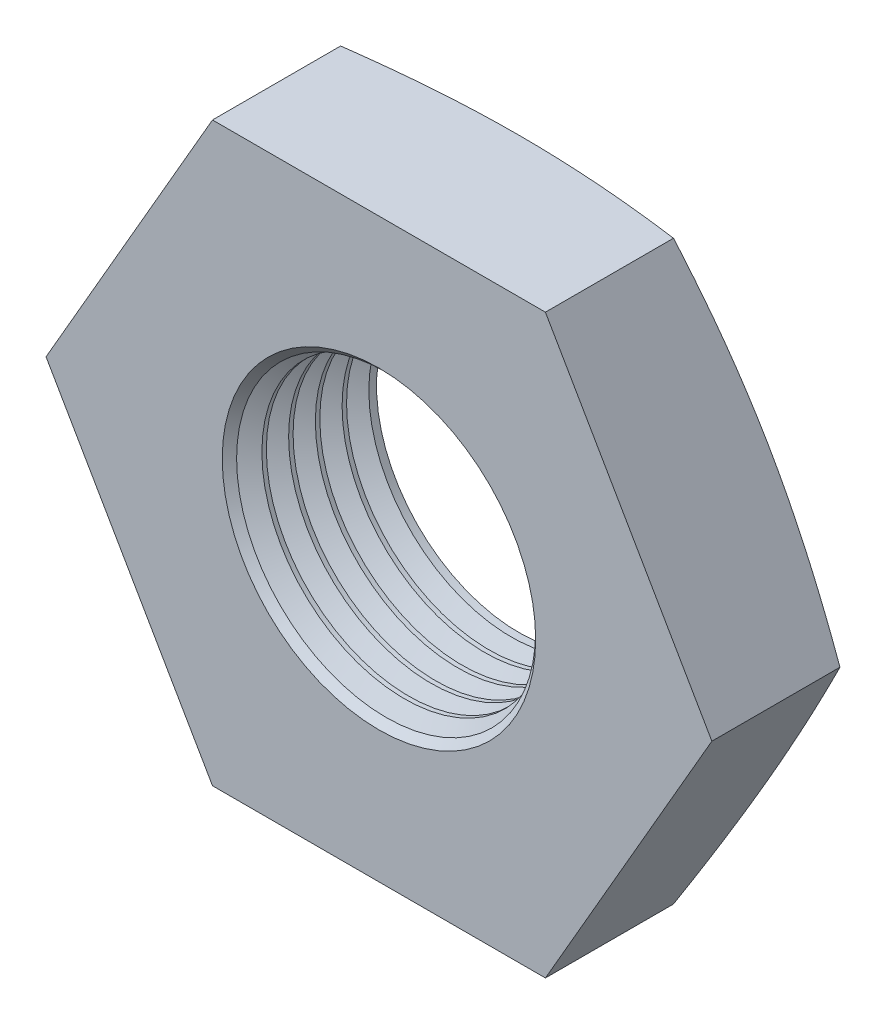
ISO-10303-21;
HEADER;
FILE_DESCRIPTION(('STEP AP214'),'2;1');
FILE_NAME('part.step','',(''),(''),'','','');
FILE_SCHEMA(('AUTOMOTIVE_DESIGN { 1 0 10303 214 1 1 1 1 }'));
ENDSEC;
DATA;
#1=APPLICATION_CONTEXT('core data for automotive mechanical design processes');
#2=APPLICATION_PROTOCOL_DEFINITION('international standard','automotive_design',2000,#1);
#3=PRODUCT_CONTEXT('',#1,'mechanical');
#4=PRODUCT('Part','Part','',(#3));
#5=PRODUCT_RELATED_PRODUCT_CATEGORY('part','',(#4));
#6=PRODUCT_DEFINITION_FORMATION('','',#4);
#7=PRODUCT_DEFINITION_CONTEXT('part definition',#1,'design');
#8=PRODUCT_DEFINITION('design','',#6,#7);
#9=PRODUCT_DEFINITION_SHAPE('','',#8);
#10=(LENGTH_UNIT() NAMED_UNIT(*) SI_UNIT(.MILLI.,.METRE.));
#11=(NAMED_UNIT(*) PLANE_ANGLE_UNIT() SI_UNIT($,.RADIAN.));
#12=(NAMED_UNIT(*) SI_UNIT($,.STERADIAN.) SOLID_ANGLE_UNIT());
#13=UNCERTAINTY_MEASURE_WITH_UNIT(LENGTH_MEASURE(1.E-05),#10,'distance_accuracy_value','');
#14=(GEOMETRIC_REPRESENTATION_CONTEXT(3) GLOBAL_UNCERTAINTY_ASSIGNED_CONTEXT((#13)) GLOBAL_UNIT_ASSIGNED_CONTEXT((#10,
#11,#12)) REPRESENTATION_CONTEXT('',''));
#15=CARTESIAN_POINT('',(0.,0.,0.));
#16=DIRECTION('',(0.,0.,1.));
#17=DIRECTION('',(1.,0.,0.));
#18=AXIS2_PLACEMENT_3D('',#15,#16,#17);
#19=CARTESIAN_POINT('',(0.,0.,-1.7));
#20=DIRECTION('',(0.,0.,1.));
#21=DIRECTION('',(1.,0.,0.));
#22=AXIS2_PLACEMENT_3D('',#19,#20,#21);
#23=CYLINDRICAL_SURFACE('',#22,1.7295);
#24=CARTESIAN_POINT('',(0.,0.,-1.7));
#25=DIRECTION('',(0.,0.,1.));
#26=DIRECTION('',(1.,0.,0.));
#27=AXIS2_PLACEMENT_3D('',#24,#25,#26);
#28=CIRCLE('',#27,1.7295);
#29=CARTESIAN_POINT('',(1.7295,0.,-1.7));
#30=VERTEX_POINT('',#29);
#31=EDGE_CURVE('E220',#30,#30,#28,.T.);
#32=ORIENTED_EDGE('',*,*,#31,.F.);
#33=EDGE_LOOP('',(#32));
#34=FACE_BOUND('',#33,.T.);
#35=CARTESIAN_POINT('',(0.,0.,-1.6066));
#36=DIRECTION('',(0.,0.,-1.));
#37=DIRECTION('',(-1.,0.,0.));
#38=AXIS2_PLACEMENT_3D('',#35,#36,#37);
#39=CIRCLE('',#38,1.7295);
#40=CARTESIAN_POINT('',(-1.7295,0.,-1.6066));
#41=VERTEX_POINT('',#40);
#42=EDGE_CURVE('E373',#41,#41,#39,.T.);
#43=ORIENTED_EDGE('',*,*,#42,.F.);
#44=EDGE_LOOP('',(#43));
#45=FACE_BOUND('',#44,.T.);
#46=ADVANCED_FACE('F36',(#34,#45),#23,.F.);
#47=CARTESIAN_POINT('',(0.,0.,-1.282));
#48=DIRECTION('',(0.,0.,-1.));
#49=DIRECTION('',(-1.,0.,0.));
#50=AXIS2_PLACEMENT_3D('',#47,#48,#49);
#51=CIRCLE('',#50,1.7295);
#52=CARTESIAN_POINT('',(-1.7295,0.,-1.282));
#53=VERTEX_POINT('',#52);
#54=EDGE_CURVE('E384',#53,#53,#51,.T.);
#55=ORIENTED_EDGE('',*,*,#54,.F.);
#56=EDGE_LOOP('',(#55));
#57=FACE_BOUND('',#56,.T.);
#58=CARTESIAN_POINT('',(0.,0.,-1.3361));
#59=DIRECTION('',(0.,0.,-1.));
#60=DIRECTION('',(-1.,0.,0.));
#61=AXIS2_PLACEMENT_3D('',#58,#59,#60);
#62=CIRCLE('',#61,1.7295);
#63=CARTESIAN_POINT('',(-1.7295,0.,-1.3361));
#64=VERTEX_POINT('',#63);
#65=EDGE_CURVE('E370',#64,#64,#62,.T.);
#66=ORIENTED_EDGE('',*,*,#65,.T.);
#67=EDGE_LOOP('',(#66));
#68=FACE_BOUND('',#67,.T.);
#69=ADVANCED_FACE('F277',(#57,#68),#23,.F.);
#70=CARTESIAN_POINT('',(0.,0.,-0.957399999999998));
#71=DIRECTION('',(0.,0.,-1.));
#72=DIRECTION('',(-1.,0.,0.));
#73=AXIS2_PLACEMENT_3D('',#70,#71,#72);
#74=CIRCLE('',#73,1.7295);
#75=CARTESIAN_POINT('',(-1.7295,0.,-0.957399999999998));
#76=VERTEX_POINT('',#75);
#77=EDGE_CURVE('E305',#76,#76,#74,.T.);
#78=ORIENTED_EDGE('',*,*,#77,.F.);
#79=EDGE_LOOP('',(#78));
#80=FACE_BOUND('',#79,.T.);
#81=CARTESIAN_POINT('',(0.,0.,-1.0115));
#82=DIRECTION('',(0.,0.,-1.));
#83=DIRECTION('',(-1.,0.,0.));
#84=AXIS2_PLACEMENT_3D('',#81,#82,#83);
#85=CIRCLE('',#84,1.7295);
#86=CARTESIAN_POINT('',(-1.7295,0.,-1.0115));
#87=VERTEX_POINT('',#86);
#88=EDGE_CURVE('E378',#87,#87,#85,.T.);
#89=ORIENTED_EDGE('',*,*,#88,.T.);
#90=EDGE_LOOP('',(#89));
#91=FACE_BOUND('',#90,.T.);
#92=ADVANCED_FACE('F283',(#80,#91),#23,.F.);
#93=CARTESIAN_POINT('',(0.,0.,-0.632799999999998));
#94=DIRECTION('',(0.,0.,-1.));
#95=DIRECTION('',(-1.,0.,0.));
#96=AXIS2_PLACEMENT_3D('',#93,#94,#95);
#97=CIRCLE('',#96,1.7295);
#98=CARTESIAN_POINT('',(-1.7295,0.,-0.632799999999998));
#99=VERTEX_POINT('',#98);
#100=EDGE_CURVE('E308',#99,#99,#97,.T.);
#101=ORIENTED_EDGE('',*,*,#100,.F.);
#102=EDGE_LOOP('',(#101));
#103=FACE_BOUND('',#102,.T.);
#104=CARTESIAN_POINT('',(0.,0.,-0.686899999999998));
#105=DIRECTION('',(0.,0.,-1.));
#106=DIRECTION('',(-1.,0.,0.));
#107=AXIS2_PLACEMENT_3D('',#104,#105,#106);
#108=CIRCLE('',#107,1.7295);
#109=CARTESIAN_POINT('',(-1.7295,0.,-0.686899999999998));
#110=VERTEX_POINT('',#109);
#111=EDGE_CURVE('E387',#110,#110,#108,.T.);
#112=ORIENTED_EDGE('',*,*,#111,.T.);
#113=EDGE_LOOP('',(#112));
#114=FACE_BOUND('',#113,.T.);
#115=ADVANCED_FACE('F288',(#103,#114),#23,.F.);
#116=CARTESIAN_POINT('',(0.,0.,-0.308199999999998));
#117=DIRECTION('',(0.,0.,-1.));
#118=DIRECTION('',(-1.,0.,0.));
#119=AXIS2_PLACEMENT_3D('',#116,#117,#118);
#120=CIRCLE('',#119,1.7295);
#121=CARTESIAN_POINT('',(-1.7295,0.,-0.308199999999998));
#122=VERTEX_POINT('',#121);
#123=EDGE_CURVE('E299',#122,#122,#120,.T.);
#124=ORIENTED_EDGE('',*,*,#123,.F.);
#125=EDGE_LOOP('',(#124));
#126=FACE_BOUND('',#125,.T.);
#127=CARTESIAN_POINT('',(0.,0.,-0.362299999999998));
#128=DIRECTION('',(0.,0.,-1.));
#129=DIRECTION('',(-1.,0.,0.));
#130=AXIS2_PLACEMENT_3D('',#127,#128,#129);
#131=CIRCLE('',#130,1.7295);
#132=CARTESIAN_POINT('',(-1.7295,0.,-0.362299999999998));
#133=VERTEX_POINT('',#132);
#134=EDGE_CURVE('E302',#133,#133,#131,.T.);
#135=ORIENTED_EDGE('',*,*,#134,.T.);
#136=EDGE_LOOP('',(#135));
#137=FACE_BOUND('',#136,.T.);
#138=ADVANCED_FACE('F279',(#126,#137),#23,.F.);
#139=CARTESIAN_POINT('',(0.,0.,-0.172949999999998));
#140=DIRECTION('',(0.,0.,1.));
#141=DIRECTION('',(1.,0.,0.));
#142=AXIS2_PLACEMENT_3D('',#139,#140,#141);
#143=CONICAL_SURFACE('',#142,1.7295,0.785398163397451);
#144=CARTESIAN_POINT('',(0.,0.,0.));
#145=DIRECTION('',(0.,0.,1.));
#146=DIRECTION('',(1.,0.,0.));
#147=AXIS2_PLACEMENT_3D('',#144,#145,#146);
#148=CIRCLE('',#147,1.90245);
#149=CARTESIAN_POINT('',(1.90245,0.,0.));
#150=VERTEX_POINT('',#149);
#151=EDGE_CURVE('E11',#150,#150,#148,.F.);
#152=ORIENTED_EDGE('',*,*,#151,.F.);
#153=EDGE_LOOP('',(#152));
#154=FACE_BOUND('',#153,.T.);
#155=CARTESIAN_POINT('',(0.,0.,-0.0872049358618433));
#156=DIRECTION('',(0.,0.,-1.));
#157=DIRECTION('',(-1.,0.,0.));
#158=AXIS2_PLACEMENT_3D('',#155,#156,#157);
#159=CIRCLE('',#158,1.81524506413816);
#160=CARTESIAN_POINT('',(-1.81524506413816,0.,-0.0872049358618433));
#161=VERTEX_POINT('',#160);
#162=EDGE_CURVE('E40',#161,#161,#159,.T.);
#163=ORIENTED_EDGE('',*,*,#162,.T.);
#164=EDGE_LOOP('',(#163));
#165=FACE_BOUND('',#164,.T.);
#166=ADVANCED_FACE('F38',(#154,#165),#143,.F.);
#167=CARTESIAN_POINT('',(-2.02072594216369,-3.5,-1.7));
#168=DIRECTION('',(0.,-1.,0.));
#169=DIRECTION('',(0.,0.,-1.));
#170=AXIS2_PLACEMENT_3D('',#167,#168,#169);
#171=PLANE('',#170);
#172=CARTESIAN_POINT('',(-5.34250540243529,-3.5,-0.926460153703001));
#173=CARTESIAN_POINT('',(-5.18375511671644,-3.5,-0.962032372708151));
#174=CARTESIAN_POINT('',(-5.02490552043847,-3.5,-0.997168370742541));
#175=CARTESIAN_POINT('',(-4.70695877225528,-3.5,-1.06633415335759));
#176=CARTESIAN_POINT('',(-4.5478616099486,-3.5,-1.10036389006764));
#177=CARTESIAN_POINT('',(-4.22922785596206,-3.5,-1.16711307984257));
#178=CARTESIAN_POINT('',(-4.06969098596063,-3.5,-1.1998312109674));
#179=CARTESIAN_POINT('',(-3.75028550399467,-3.5,-1.26359691073799));
#180=CARTESIAN_POINT('',(-3.59041689484826,-3.5,-1.29464449351522));
#181=CARTESIAN_POINT('',(-3.11278775858948,-3.5,-1.38424317610052));
#182=CARTESIAN_POINT('',(-2.7944536274191,-3.5,-1.4397960921004));
#183=CARTESIAN_POINT('',(-2.15584280750445,-3.5,-1.53857753520242));
#184=CARTESIAN_POINT('',(-1.83556646684102,-3.5,-1.58180820769069));
#185=CARTESIAN_POINT('',(-1.35186201394615,-3.5,-1.63326780806071));
#186=CARTESIAN_POINT('',(-1.18915391181551,-3.5,-1.64823562569859));
#187=CARTESIAN_POINT('',(-0.863327752554062,-3.5,-1.67279914319906));
#188=CARTESIAN_POINT('',(-0.700209704910771,-3.5,-1.6823949662583));
#189=CARTESIAN_POINT('',(-0.373802177523218,-3.5,-1.69565632714604));
#190=CARTESIAN_POINT('',(-0.21051280887918,-3.5,-1.69932454883453));
#191=CARTESIAN_POINT('',(0.116088611208562,-3.5,-1.70050481492705));
#192=CARTESIAN_POINT('',(0.27940066263463,-3.5,-1.69801686409105));
#193=CARTESIAN_POINT('',(0.60640968441319,-3.5,-1.68702500364934));
#194=CARTESIAN_POINT('',(0.77010590916335,-3.5,-1.67849935713373));
#195=CARTESIAN_POINT('',(1.09711815279145,-3.5,-1.65591780097622));
#196=CARTESIAN_POINT('',(1.26043415057105,-3.5,-1.64186159147595));
#197=CARTESIAN_POINT('',(1.58667719858699,-3.5,-1.60892981836055));
#198=CARTESIAN_POINT('',(1.74960393516029,-3.5,-1.59005119345729));
#199=CARTESIAN_POINT('',(2.07493184102748,-3.5,-1.54825406645032));
#200=CARTESIAN_POINT('',(2.23733300867335,-3.5,-1.52533555169116));
#201=CARTESIAN_POINT('',(2.70201244280079,-3.5,-1.45494463873053));
#202=CARTESIAN_POINT('',(3.00366965520128,-3.5,-1.40339226790375));
#203=CARTESIAN_POINT('',(3.60558094545378,-3.5,-1.29266255628891));
#204=CARTESIAN_POINT('',(3.90583484122203,-3.5,-1.2334842530017));
#205=CARTESIAN_POINT('',(4.50535507961957,-3.5,-1.11000595354002));
#206=CARTESIAN_POINT('',(4.80462116673555,-3.5,-1.04570472614207));
#207=CARTESIAN_POINT('',(5.40235855476505,-3.5,-0.913615750470934));
#208=CARTESIAN_POINT('',(5.70082990089598,-3.5,-0.845828205214062));
#209=CARTESIAN_POINT('',(6.29427282929031,-3.5,-0.708480432636206));
#210=CARTESIAN_POINT('',(6.58924997937444,-3.5,-0.638944173015077));
#211=CARTESIAN_POINT('',(7.17879272941702,-3.5,-0.49812969725047));
#212=CARTESIAN_POINT('',(7.47335832180681,-3.5,-0.426851449505792));
#213=CARTESIAN_POINT('',(8.06181238798381,-3.5,-0.283096465858741));
#214=CARTESIAN_POINT('',(8.35570124898792,-3.5,-0.210621311664311));
#215=CARTESIAN_POINT('',(8.94322286292841,-3.5,-0.0646806148985115));
#216=CARTESIAN_POINT('',(9.23685562397808,-3.5,0.00878489498778544));
#217=CARTESIAN_POINT('',(9.53039909334217,-3.5,0.0826012901986862));
#218=B_SPLINE_CURVE_WITH_KNOTS('',3,(#172,#173,#174,#175,#176,#177,#178,#179,#180,#181,#182,
#183,#184,#185,#186,#187,#188,#189,#190,#191,#192,#193,#194,#195,#196,#197,#198,#199,#200,#201,
#202,#203,#204,#205,#206,#207,#208,#209,#210,#211,#212,#213,#214,#215,#216,#217),.UNSPECIFIED.,
.F.,.F.,(4,2,2,2,2,2,2,2,2,2,2,2,2,2,2,2,2,2,2,2,2,2,4),(0.,0.488062347012476,0.976145785631088,
1.46470938191903,1.95326884470765,2.92256552954151,3.8916933500248,4.38180449892748,
4.8719044075891,5.36178234983076,5.85165991329731,6.34331015910023,6.83498706507532,
7.32697686849975,7.8189682131699,8.7368879457719,9.65492364634101,10.5731806534719,
11.491384248794,12.4005642685826,13.3097607939584,14.2178391858651,15.1258876811447),.UNSPECIFIED.);
#219=CARTESIAN_POINT('',(2.02072594216368,-3.5,-1.55491840485417));
#220=VERTEX_POINT('',#219);
#221=CARTESIAN_POINT('',(0.,-3.5,-1.7));
#222=VERTEX_POINT('',#221);
#223=EDGE_CURVE('E218',#220,#222,#218,.F.);
#224=ORIENTED_EDGE('',*,*,#223,.F.);
#225=DIRECTION('',(0.,0.,1.));
#226=VECTOR('',#225,1.);
#227=CARTESIAN_POINT('',(2.02072594216369,-3.5,-1.7));
#228=LINE('',#227,#226);
#229=CARTESIAN_POINT('',(2.02072594216369,-3.5,0.));
#230=VERTEX_POINT('',#229);
#231=EDGE_CURVE('E241',#220,#230,#228,.T.);
#232=ORIENTED_EDGE('',*,*,#231,.T.);
#233=DIRECTION('',(1.,0.,0.));
#234=VECTOR('',#233,1.);
#235=CARTESIAN_POINT('',(-2.02072594216369,-3.5,0.));
#236=LINE('',#235,#234);
#237=CARTESIAN_POINT('',(-2.02072594216369,-3.5,0.));
#238=VERTEX_POINT('',#237);
#239=EDGE_CURVE('E223',#238,#230,#236,.T.);
#240=ORIENTED_EDGE('',*,*,#239,.F.);
#241=DIRECTION('',(0.,0.,1.));
#242=VECTOR('',#241,1.);
#243=CARTESIAN_POINT('',(-2.02072594216369,-3.5,-1.7));
#244=LINE('',#243,#242);
#245=CARTESIAN_POINT('',(-2.02072594216369,-3.5,-1.55491840485417));
#246=VERTEX_POINT('',#245);
#247=EDGE_CURVE('E60',#246,#238,#244,.T.);
#248=ORIENTED_EDGE('',*,*,#247,.F.);
#249=EDGE_CURVE('E212',#222,#246,#218,.F.);
#250=ORIENTED_EDGE('',*,*,#249,.F.);
#251=EDGE_LOOP('',(#224,#232,#240,#248,#250));
#252=FACE_BOUND('',#251,.T.);
#253=ADVANCED_FACE('F207',(#252),#171,.T.);
#254=CARTESIAN_POINT('',(-4.04145188432738,0.,-1.7));
#255=DIRECTION('',(-0.866025403784439,-0.5,0.));
#256=DIRECTION('',(0.5,-0.866025403784439,0.));
#257=AXIS2_PLACEMENT_3D('',#254,#255,#256);
#258=PLANE('',#257);
#259=CARTESIAN_POINT('',(-2.02061047210985,-3.5002,-1.55488746342053));
#260=CARTESIAN_POINT('',(-2.10453570366722,-3.35483723490565,-1.57738559382202));
#261=CARTESIAN_POINT('',(-2.18861311055532,-3.20921089440683,-1.59781025450598));
#262=CARTESIAN_POINT('',(-2.35706487716359,-2.91744387601656,-1.63369455339474));
#263=CARTESIAN_POINT('',(-2.44143934349251,-2.77130301347336,-1.64915217450553));
#264=CARTESIAN_POINT('',(-2.6099736178049,-2.47939308754755,-1.67419991225358));
#265=CARTESIAN_POINT('',(-2.69413228593377,-2.33362599845102,-1.68381990209048));
#266=CARTESIAN_POINT('',(-2.86255695641052,-2.04190591193726,-1.69671933246686));
#267=CARTESIAN_POINT('',(-2.94682293482803,-1.89595295596863,-1.7));
#268=CARTESIAN_POINT('',(-3.11535489166305,-1.60404704403137,-1.7));
#269=CARTESIAN_POINT('',(-3.19962087008056,-1.45809408806274,-1.69671933246686));
#270=CARTESIAN_POINT('',(-3.3680455405573,-1.16637400154897,-1.68381990209048));
#271=CARTESIAN_POINT('',(-3.45220420868617,-1.02060691245244,-1.67419991225358));
#272=CARTESIAN_POINT('',(-3.62073848299856,-0.728696986526635,-1.64915217450553));
#273=CARTESIAN_POINT('',(-3.70511294932748,-0.582556123983436,-1.63369455339474));
#274=CARTESIAN_POINT('',(-3.87356471593575,-0.290789105593171,-1.59781025450598));
#275=CARTESIAN_POINT('',(-3.95764212282385,-0.145162765094345,-1.57738559382201));
#276=CARTESIAN_POINT('',(-4.04156735438122,0.000200000000001623,-1.55488746342053));
#277=B_SPLINE_CURVE_WITH_KNOTS('',3,(#259,#260,#261,#262,#263,#264,#265,#266,#267,#268,#269,
#270,#271,#272,#273,#274,#275,#276),.UNSPECIFIED.,.F.,.F.,(4,2,2,2,2,2,2,2,4),(0.,
0.508081243376833,1.01636855642799,1.52203235492776,2.02759827097034,2.53316418701292,
3.03882798551268,3.54711529856384,4.05519654194067),.UNSPECIFIED.);
#278=CARTESIAN_POINT('',(-3.03108891324554,-1.75,-1.7));
#279=VERTEX_POINT('',#278);
#280=EDGE_CURVE('E219',#246,#279,#277,.T.);
#281=ORIENTED_EDGE('',*,*,#280,.F.);
#282=ORIENTED_EDGE('',*,*,#247,.T.);
#283=DIRECTION('',(0.5,-0.866025403784439,0.));
#284=VECTOR('',#283,1.);
#285=CARTESIAN_POINT('',(-4.04145188432738,0.,0.));
#286=LINE('',#285,#284);
#287=CARTESIAN_POINT('',(-4.04145188432738,0.,0.));
#288=VERTEX_POINT('',#287);
#289=EDGE_CURVE('E238',#288,#238,#286,.T.);
#290=ORIENTED_EDGE('',*,*,#289,.F.);
#291=DIRECTION('',(0.,0.,1.));
#292=VECTOR('',#291,1.);
#293=CARTESIAN_POINT('',(-4.04145188432738,0.,-1.7));
#294=LINE('',#293,#292);
#295=CARTESIAN_POINT('',(-4.04145188432738,0.,-1.55491840485417));
#296=VERTEX_POINT('',#295);
#297=EDGE_CURVE('E243',#296,#288,#294,.T.);
#298=ORIENTED_EDGE('',*,*,#297,.F.);
#299=EDGE_CURVE('E119',#279,#296,#277,.T.);
#300=ORIENTED_EDGE('',*,*,#299,.F.);
#301=EDGE_LOOP('',(#281,#282,#290,#298,#300));
#302=FACE_BOUND('',#301,.T.);
#303=ADVANCED_FACE('F210',(#302),#258,.T.);
#304=CARTESIAN_POINT('',(-2.02072594216369,3.5,-1.7));
#305=DIRECTION('',(-0.866025403784439,0.5,0.));
#306=DIRECTION('',(-0.5,-0.866025403784439,0.));
#307=AXIS2_PLACEMENT_3D('',#304,#305,#306);
#308=PLANE('',#307);
#309=CARTESIAN_POINT('',(-4.04156735438122,-0.00019999999999794,-1.55488746342053));
#310=CARTESIAN_POINT('',(-3.95764212282385,0.145162765094349,-1.57738559382201));
#311=CARTESIAN_POINT('',(-3.87356471593575,0.290789105593175,-1.59781025450598));
#312=CARTESIAN_POINT('',(-3.70511294932748,0.58255612398344,-1.63369455339474));
#313=CARTESIAN_POINT('',(-3.62073848299856,0.728696986526638,-1.64915217450553));
#314=CARTESIAN_POINT('',(-3.45220420868617,1.02060691245245,-1.67419991225358));
#315=CARTESIAN_POINT('',(-3.3680455405573,1.16637400154898,-1.68381990209048));
#316=CARTESIAN_POINT('',(-3.19962087008056,1.45809408806274,-1.69671933246686));
#317=CARTESIAN_POINT('',(-3.11535489166305,1.60404704403137,-1.7));
#318=CARTESIAN_POINT('',(-2.94682293482803,1.89595295596863,-1.7));
#319=CARTESIAN_POINT('',(-2.86255695641052,2.04190591193726,-1.69671933246686));
#320=CARTESIAN_POINT('',(-2.69413228593377,2.33362599845103,-1.68381990209048));
#321=CARTESIAN_POINT('',(-2.6099736178049,2.47939308754756,-1.67419991225358));
#322=CARTESIAN_POINT('',(-2.44143934349251,2.77130301347336,-1.64915217450553));
#323=CARTESIAN_POINT('',(-2.35706487716359,2.91744387601656,-1.63369455339474));
#324=CARTESIAN_POINT('',(-2.18861311055532,3.20921089440683,-1.59781025450598));
#325=CARTESIAN_POINT('',(-2.10453570366722,3.35483723490565,-1.57738559382201));
#326=CARTESIAN_POINT('',(-2.02061047210985,3.5002,-1.55488746342053));
#327=B_SPLINE_CURVE_WITH_KNOTS('',3,(#309,#310,#311,#312,#313,#314,#315,#316,#317,#318,#319,
#320,#321,#322,#323,#324,#325,#326),.UNSPECIFIED.,.F.,.F.,(4,2,2,2,2,2,2,2,4),(0.,
0.508081243376834,1.01636855642799,1.52203235492776,2.02759827097034,2.53316418701292,
3.03882798551268,3.54711529856384,4.05519654194067),.UNSPECIFIED.);
#328=CARTESIAN_POINT('',(-3.03108891324554,1.75,-1.7));
#329=VERTEX_POINT('',#328);
#330=EDGE_CURVE('E112',#296,#329,#327,.T.);
#331=ORIENTED_EDGE('',*,*,#330,.F.);
#332=ORIENTED_EDGE('',*,*,#297,.T.);
#333=DIRECTION('',(-0.5,-0.866025403784438,0.));
#334=VECTOR('',#333,1.);
#335=CARTESIAN_POINT('',(-2.02072594216369,3.5,0.));
#336=LINE('',#335,#334);
#337=CARTESIAN_POINT('',(-2.02072594216369,3.5,0.));
#338=VERTEX_POINT('',#337);
#339=EDGE_CURVE('E235',#338,#288,#336,.T.);
#340=ORIENTED_EDGE('',*,*,#339,.F.);
#341=DIRECTION('',(0.,0.,1.));
#342=VECTOR('',#341,1.);
#343=CARTESIAN_POINT('',(-2.02072594216369,3.5,-1.7));
#344=LINE('',#343,#342);
#345=CARTESIAN_POINT('',(-2.02072594216369,3.5,-1.55491840485417));
#346=VERTEX_POINT('',#345);
#347=EDGE_CURVE('E143',#346,#338,#344,.T.);
#348=ORIENTED_EDGE('',*,*,#347,.F.);
#349=EDGE_CURVE('E123',#329,#346,#327,.T.);
#350=ORIENTED_EDGE('',*,*,#349,.F.);
#351=EDGE_LOOP('',(#331,#332,#340,#348,#350));
#352=FACE_BOUND('',#351,.T.);
#353=ADVANCED_FACE('F141',(#352),#308,.T.);
#354=CARTESIAN_POINT('',(2.02072594216369,3.5,-1.7));
#355=DIRECTION('',(0.,1.,0.));
#356=DIRECTION('',(0.,0.,1.));
#357=AXIS2_PLACEMENT_3D('',#354,#355,#356);
#358=PLANE('',#357);
#359=CARTESIAN_POINT('',(-5.34250540243529,3.5,-0.926460153703));
#360=CARTESIAN_POINT('',(-5.18375511671645,3.5,-0.962032372708149));
#361=CARTESIAN_POINT('',(-5.02490552043847,3.5,-0.997168370742539));
#362=CARTESIAN_POINT('',(-4.70695877225528,3.5,-1.06633415335759));
#363=CARTESIAN_POINT('',(-4.5478616099486,3.5,-1.10036389006764));
#364=CARTESIAN_POINT('',(-4.22922785596207,3.5,-1.16711307984257));
#365=CARTESIAN_POINT('',(-4.06969098596063,3.5,-1.1998312109674));
#366=CARTESIAN_POINT('',(-3.75028550399467,3.5,-1.26359691073799));
#367=CARTESIAN_POINT('',(-3.59041689484826,3.5,-1.29464449351522));
#368=CARTESIAN_POINT('',(-3.11278775858948,3.5,-1.38424317610052));
#369=CARTESIAN_POINT('',(-2.7944536274191,3.5,-1.4397960921004));
#370=CARTESIAN_POINT('',(-2.15584280750445,3.5,-1.53857753520242));
#371=CARTESIAN_POINT('',(-1.83556646684103,3.5,-1.58180820769069));
#372=CARTESIAN_POINT('',(-1.35186201394615,3.5,-1.63326780806071));
#373=CARTESIAN_POINT('',(-1.18915391181551,3.5,-1.64823562569858));
#374=CARTESIAN_POINT('',(-0.863327752554063,3.5,-1.67279914319906));
#375=CARTESIAN_POINT('',(-0.700209704910772,3.5,-1.68239496625829));
#376=CARTESIAN_POINT('',(-0.373802177523219,3.5,-1.69565632714604));
#377=CARTESIAN_POINT('',(-0.210512808879181,3.5,-1.69932454883453));
#378=CARTESIAN_POINT('',(0.116088611208562,3.5,-1.70050481492704));
#379=CARTESIAN_POINT('',(0.27940066263463,3.5,-1.69801686409105));
#380=CARTESIAN_POINT('',(0.606409684413191,3.5,-1.68702500364934));
#381=CARTESIAN_POINT('',(0.770105909163351,3.5,-1.67849935713373));
#382=CARTESIAN_POINT('',(1.09711815279145,3.5,-1.65591780097622));
#383=CARTESIAN_POINT('',(1.26043415057105,3.5,-1.64186159147595));
#384=CARTESIAN_POINT('',(1.58667719858699,3.5,-1.60892981836055));
#385=CARTESIAN_POINT('',(1.74960393516029,3.5,-1.59005119345729));
#386=CARTESIAN_POINT('',(2.07493184102749,3.5,-1.54825406645032));
#387=CARTESIAN_POINT('',(2.23733300867335,3.5,-1.52533555169116));
#388=CARTESIAN_POINT('',(2.7020124428008,3.5,-1.45494463873052));
#389=CARTESIAN_POINT('',(3.00366965520129,3.5,-1.40339226790375));
#390=CARTESIAN_POINT('',(3.60558094545379,3.5,-1.29266255628891));
#391=CARTESIAN_POINT('',(3.90583484122204,3.5,-1.2334842530017));
#392=CARTESIAN_POINT('',(4.50535507961957,3.5,-1.11000595354002));
#393=CARTESIAN_POINT('',(4.80462116673556,3.5,-1.04570472614207));
#394=CARTESIAN_POINT('',(5.40235855476505,3.5,-0.913615750470932));
#395=CARTESIAN_POINT('',(5.70082990089599,3.5,-0.84582820521406));
#396=CARTESIAN_POINT('',(6.29427282929031,3.5,-0.708480432636204));
#397=CARTESIAN_POINT('',(6.58924997937445,3.5,-0.638944173015075));
#398=CARTESIAN_POINT('',(7.17879272941703,3.5,-0.498129697250468));
#399=CARTESIAN_POINT('',(7.47335832180682,3.5,-0.426851449505791));
#400=CARTESIAN_POINT('',(8.06181238798382,3.5,-0.28309646585874));
#401=CARTESIAN_POINT('',(8.35570124898793,3.5,-0.21062131166431));
#402=CARTESIAN_POINT('',(8.94322286292842,3.5,-0.0646806148985103));
#403=CARTESIAN_POINT('',(9.23685562397808,3.5,0.00878489498778664));
#404=CARTESIAN_POINT('',(9.53039909334217,3.5,0.0826012901986869));
#405=B_SPLINE_CURVE_WITH_KNOTS('',3,(#359,#360,#361,#362,#363,#364,#365,#366,#367,#368,#369,
#370,#371,#372,#373,#374,#375,#376,#377,#378,#379,#380,#381,#382,#383,#384,#385,#386,#387,#388,
#389,#390,#391,#392,#393,#394,#395,#396,#397,#398,#399,#400,#401,#402,#403,#404),.UNSPECIFIED.,
.F.,.F.,(4,2,2,2,2,2,2,2,2,2,2,2,2,2,2,2,2,2,2,2,2,2,4),(0.,0.488062347012478,0.97614578563109,
1.46470938191903,1.95326884470766,2.92256552954152,3.8916933500248,4.38180449892748,
4.8719044075891,5.36178234983076,5.85165991329732,6.34331015910024,6.83498706507533,
7.32697686849975,7.81896821316991,8.73688794577191,9.65492364634102,10.5731806534719,
11.491384248794,12.4005642685826,13.3097607939584,14.2178391858651,15.1258876811447),.UNSPECIFIED.);
#406=CARTESIAN_POINT('',(0.,3.5,-1.7));
#407=VERTEX_POINT('',#406);
#408=EDGE_CURVE('E130',#346,#407,#405,.T.);
#409=ORIENTED_EDGE('',*,*,#408,.F.);
#410=ORIENTED_EDGE('',*,*,#347,.T.);
#411=DIRECTION('',(-1.,0.,0.));
#412=VECTOR('',#411,1.);
#413=CARTESIAN_POINT('',(2.02072594216369,3.5,0.));
#414=LINE('',#413,#412);
#415=CARTESIAN_POINT('',(2.02072594216369,3.5,0.));
#416=VERTEX_POINT('',#415);
#417=EDGE_CURVE('E232',#416,#338,#414,.T.);
#418=ORIENTED_EDGE('',*,*,#417,.F.);
#419=DIRECTION('',(0.,0.,1.));
#420=VECTOR('',#419,1.);
#421=CARTESIAN_POINT('',(2.02072594216369,3.5,-1.7));
#422=LINE('',#421,#420);
#423=CARTESIAN_POINT('',(2.02072594216368,3.50000000000001,-1.55491840485417));
#424=VERTEX_POINT('',#423);
#425=EDGE_CURVE('E246',#424,#416,#422,.T.);
#426=ORIENTED_EDGE('',*,*,#425,.F.);
#427=EDGE_CURVE('E144',#407,#424,#405,.T.);
#428=ORIENTED_EDGE('',*,*,#427,.F.);
#429=EDGE_LOOP('',(#409,#410,#418,#426,#428));
#430=FACE_BOUND('',#429,.T.);
#431=ADVANCED_FACE('F201',(#430),#358,.T.);
#432=CARTESIAN_POINT('',(4.04145188432738,0.,-1.7));
#433=DIRECTION('',(0.866025403784439,0.5,0.));
#434=DIRECTION('',(-0.5,0.866025403784438,0.));
#435=AXIS2_PLACEMENT_3D('',#432,#433,#434);
#436=PLANE('',#435);
#437=CARTESIAN_POINT('',(2.02061047210985,3.5002,-1.55488746342053));
#438=CARTESIAN_POINT('',(2.10453570366722,3.35483723490566,-1.57738559382202));
#439=CARTESIAN_POINT('',(2.18861311055531,3.20921089440683,-1.59781025450598));
#440=CARTESIAN_POINT('',(2.35706487716359,2.91744387601656,-1.63369455339474));
#441=CARTESIAN_POINT('',(2.44143934349251,2.77130301347336,-1.64915217450553));
#442=CARTESIAN_POINT('',(2.6099736178049,2.47939308754756,-1.67419991225359));
#443=CARTESIAN_POINT('',(2.69413228593377,2.33362599845102,-1.68381990209048));
#444=CARTESIAN_POINT('',(2.86255695641051,2.04190591193726,-1.69671933246686));
#445=CARTESIAN_POINT('',(2.94682293482802,1.89595295596863,-1.7));
#446=CARTESIAN_POINT('',(3.11535489166304,1.60404704403137,-1.7));
#447=CARTESIAN_POINT('',(3.19962087008055,1.45809408806274,-1.69671933246686));
#448=CARTESIAN_POINT('',(3.36804554055729,1.16637400154898,-1.68381990209048));
#449=CARTESIAN_POINT('',(3.45220420868616,1.02060691245245,-1.67419991225359));
#450=CARTESIAN_POINT('',(3.62073848299855,0.728696986526638,-1.64915217450553));
#451=CARTESIAN_POINT('',(3.70511294932747,0.582556123983439,-1.63369455339474));
#452=CARTESIAN_POINT('',(3.87356471593575,0.290789105593174,-1.59781025450598));
#453=CARTESIAN_POINT('',(3.95764212282385,0.145162765094348,-1.57738559382202));
#454=CARTESIAN_POINT('',(4.04156735438121,-0.000199999999999039,-1.55488746342053));
#455=B_SPLINE_CURVE_WITH_KNOTS('',3,(#437,#438,#439,#440,#441,#442,#443,#444,#445,#446,#447,
#448,#449,#450,#451,#452,#453,#454),.UNSPECIFIED.,.F.,.F.,(4,2,2,2,2,2,2,2,4),(0.,
0.508081243376833,1.016368556428,1.52203235492776,2.02759827097034,2.53316418701292,
3.03882798551268,3.54711529856384,4.05519654194067),.UNSPECIFIED.);
#456=CARTESIAN_POINT('',(3.03108891324553,1.75,-1.7));
#457=VERTEX_POINT('',#456);
#458=EDGE_CURVE('E195',#424,#457,#455,.T.);
#459=ORIENTED_EDGE('',*,*,#458,.F.);
#460=ORIENTED_EDGE('',*,*,#425,.T.);
#461=DIRECTION('',(-0.5,0.866025403784439,0.));
#462=VECTOR('',#461,1.);
#463=CARTESIAN_POINT('',(4.04145188432738,0.,0.));
#464=LINE('',#463,#462);
#465=CARTESIAN_POINT('',(4.04145188432738,0.,0.));
#466=VERTEX_POINT('',#465);
#467=EDGE_CURVE('E229',#466,#416,#464,.T.);
#468=ORIENTED_EDGE('',*,*,#467,.F.);
#469=DIRECTION('',(0.,0.,1.));
#470=VECTOR('',#469,1.);
#471=CARTESIAN_POINT('',(4.04145188432738,0.,-1.7));
#472=LINE('',#471,#470);
#473=CARTESIAN_POINT('',(4.04145188432738,0.,-1.55491840485417));
#474=VERTEX_POINT('',#473);
#475=EDGE_CURVE('E248',#474,#466,#472,.T.);
#476=ORIENTED_EDGE('',*,*,#475,.F.);
#477=EDGE_CURVE('E188',#457,#474,#455,.T.);
#478=ORIENTED_EDGE('',*,*,#477,.F.);
#479=EDGE_LOOP('',(#459,#460,#468,#476,#478));
#480=FACE_BOUND('',#479,.T.);
#481=ADVANCED_FACE('F197',(#480),#436,.T.);
#482=CARTESIAN_POINT('',(2.02072594216369,-3.5,-1.7));
#483=DIRECTION('',(0.866025403784439,-0.5,0.));
#484=DIRECTION('',(0.5,0.866025403784439,0.));
#485=AXIS2_PLACEMENT_3D('',#482,#483,#484);
#486=PLANE('',#485);
#487=CARTESIAN_POINT('',(4.04156735438122,0.000200000000000062,-1.55488746342053));
#488=CARTESIAN_POINT('',(3.95764212282385,-0.145162765094347,-1.57738559382202));
#489=CARTESIAN_POINT('',(3.87356471593575,-0.290789105593173,-1.59781025450598));
#490=CARTESIAN_POINT('',(3.70511294932748,-0.582556123983438,-1.63369455339474));
#491=CARTESIAN_POINT('',(3.62073848299856,-0.728696986526636,-1.64915217450553));
#492=CARTESIAN_POINT('',(3.45220420868617,-1.02060691245244,-1.67419991225359));
#493=CARTESIAN_POINT('',(3.3680455405573,-1.16637400154898,-1.68381990209048));
#494=CARTESIAN_POINT('',(3.19962087008055,-1.45809408806274,-1.69671933246686));
#495=CARTESIAN_POINT('',(3.11535489166304,-1.60404704403137,-1.7));
#496=CARTESIAN_POINT('',(2.94682293482802,-1.89595295596863,-1.7));
#497=CARTESIAN_POINT('',(2.86255695641051,-2.04190591193726,-1.69671933246686));
#498=CARTESIAN_POINT('',(2.69413228593377,-2.33362599845102,-1.68381990209048));
#499=CARTESIAN_POINT('',(2.6099736178049,-2.47939308754755,-1.67419991225359));
#500=CARTESIAN_POINT('',(2.44143934349251,-2.77130301347336,-1.64915217450553));
#501=CARTESIAN_POINT('',(2.35706487716359,-2.91744387601656,-1.63369455339474));
#502=CARTESIAN_POINT('',(2.18861311055532,-3.20921089440682,-1.59781025450598));
#503=CARTESIAN_POINT('',(2.10453570366722,-3.35483723490565,-1.57738559382202));
#504=CARTESIAN_POINT('',(2.02061047210985,-3.5002,-1.55488746342053));
#505=B_SPLINE_CURVE_WITH_KNOTS('',3,(#487,#488,#489,#490,#491,#492,#493,#494,#495,#496,#497,
#498,#499,#500,#501,#502,#503,#504),.UNSPECIFIED.,.F.,.F.,(4,2,2,2,2,2,2,2,4),(0.,
0.508081243376833,1.01636855642799,1.52203235492776,2.02759827097033,2.53316418701291,
3.03882798551268,3.54711529856384,4.05519654194067),.UNSPECIFIED.);
#506=CARTESIAN_POINT('',(3.03108891324553,-1.75,-1.7));
#507=VERTEX_POINT('',#506);
#508=EDGE_CURVE('E196',#474,#507,#505,.T.);
#509=ORIENTED_EDGE('',*,*,#508,.F.);
#510=ORIENTED_EDGE('',*,*,#475,.T.);
#511=DIRECTION('',(0.5,0.866025403784438,0.));
#512=VECTOR('',#511,1.);
#513=CARTESIAN_POINT('',(2.02072594216369,-3.5,0.));
#514=LINE('',#513,#512);
#515=EDGE_CURVE('E226',#230,#466,#514,.T.);
#516=ORIENTED_EDGE('',*,*,#515,.F.);
#517=ORIENTED_EDGE('',*,*,#231,.F.);
#518=EDGE_CURVE('E133',#507,#220,#505,.T.);
#519=ORIENTED_EDGE('',*,*,#518,.F.);
#520=EDGE_LOOP('',(#509,#510,#516,#517,#519));
#521=FACE_BOUND('',#520,.T.);
#522=ADVANCED_FACE('F200',(#521),#486,.T.);
#523=CARTESIAN_POINT('',(2.02072594216369,-3.5,-1.7));
#524=DIRECTION('',(0.,0.,1.));
#525=DIRECTION('',(1.,0.,0.));
#526=AXIS2_PLACEMENT_3D('',#523,#524,#525);
#527=PLANE('',#526);
#528=ORIENTED_EDGE('',*,*,#31,.T.);
#529=EDGE_LOOP('',(#528));
#530=FACE_BOUND('',#529,.T.);
#531=CARTESIAN_POINT('',(0.,0.,-1.7));
#532=DIRECTION('',(0.,0.,1.));
#533=DIRECTION('',(1.,0.,0.));
#534=AXIS2_PLACEMENT_3D('',#531,#532,#533);
#535=CIRCLE('',#534,3.5);
#536=EDGE_CURVE('E52',#457,#507,#535,.F.);
#537=ORIENTED_EDGE('',*,*,#536,.T.);
#538=EDGE_CURVE('E45',#507,#222,#535,.F.);
#539=ORIENTED_EDGE('',*,*,#538,.T.);
#540=EDGE_CURVE('E137',#222,#279,#535,.F.);
#541=ORIENTED_EDGE('',*,*,#540,.T.);
#542=EDGE_CURVE('E116',#279,#329,#535,.F.);
#543=ORIENTED_EDGE('',*,*,#542,.T.);
#544=CARTESIAN_POINT('',(0.,0.,-1.7));
#545=DIRECTION('',(0.,0.,-1.));
#546=DIRECTION('',(-1.,0.,0.));
#547=AXIS2_PLACEMENT_3D('',#544,#545,#546);
#548=CIRCLE('',#547,3.5);
#549=EDGE_CURVE('E127',#329,#407,#548,.T.);
#550=ORIENTED_EDGE('',*,*,#549,.T.);
#551=EDGE_CURVE('E138',#407,#457,#535,.F.);
#552=ORIENTED_EDGE('',*,*,#551,.T.);
#553=EDGE_LOOP('',(#537,#539,#541,#543,#550,#552));
#554=FACE_BOUND('',#553,.T.);
#555=ADVANCED_FACE('F135',(#530,#554),#527,.F.);
#556=CARTESIAN_POINT('',(2.02072594216369,-3.5,0.));
#557=DIRECTION('',(0.,0.,1.));
#558=DIRECTION('',(1.,0.,0.));
#559=AXIS2_PLACEMENT_3D('',#556,#557,#558);
#560=PLANE('',#559);
#561=ORIENTED_EDGE('',*,*,#151,.T.);
#562=EDGE_LOOP('',(#561));
#563=FACE_BOUND('',#562,.T.);
#564=ORIENTED_EDGE('',*,*,#239,.T.);
#565=ORIENTED_EDGE('',*,*,#515,.T.);
#566=ORIENTED_EDGE('',*,*,#467,.T.);
#567=ORIENTED_EDGE('',*,*,#417,.T.);
#568=ORIENTED_EDGE('',*,*,#339,.T.);
#569=ORIENTED_EDGE('',*,*,#289,.T.);
#570=EDGE_LOOP('',(#564,#565,#566,#567,#568,#569));
#571=FACE_BOUND('',#570,.T.);
#572=ADVANCED_FACE('F172',(#563,#571),#560,.T.);
#573=CARTESIAN_POINT('',(0.,0.,-1.55491840485417));
#574=DIRECTION('',(0.,0.,1.));
#575=DIRECTION('',(1.,0.,0.));
#576=AXIS2_PLACEMENT_3D('',#573,#574,#575);
#577=CONICAL_SURFACE('',#576,4.04145188432738,1.30899693899575);
#578=ORIENTED_EDGE('',*,*,#477,.T.);
#579=ORIENTED_EDGE('',*,*,#508,.T.);
#580=ORIENTED_EDGE('',*,*,#536,.F.);
#581=EDGE_LOOP('',(#578,#579,#580));
#582=FACE_BOUND('',#581,.T.);
#583=ADVANCED_FACE('F166',(#582),#577,.T.);
#584=ORIENTED_EDGE('',*,*,#427,.T.);
#585=ORIENTED_EDGE('',*,*,#458,.T.);
#586=ORIENTED_EDGE('',*,*,#551,.F.);
#587=EDGE_LOOP('',(#584,#585,#586));
#588=FACE_BOUND('',#587,.T.);
#589=ADVANCED_FACE('F171',(#588),#577,.T.);
#590=ORIENTED_EDGE('',*,*,#349,.T.);
#591=ORIENTED_EDGE('',*,*,#408,.T.);
#592=ORIENTED_EDGE('',*,*,#549,.F.);
#593=EDGE_LOOP('',(#590,#591,#592));
#594=FACE_BOUND('',#593,.T.);
#595=ADVANCED_FACE('F128',(#594),#577,.T.);
#596=ORIENTED_EDGE('',*,*,#299,.T.);
#597=ORIENTED_EDGE('',*,*,#330,.T.);
#598=ORIENTED_EDGE('',*,*,#542,.F.);
#599=EDGE_LOOP('',(#596,#597,#598));
#600=FACE_BOUND('',#599,.T.);
#601=ADVANCED_FACE('F114',(#600),#577,.T.);
#602=ORIENTED_EDGE('',*,*,#249,.T.);
#603=ORIENTED_EDGE('',*,*,#280,.T.);
#604=ORIENTED_EDGE('',*,*,#540,.F.);
#605=EDGE_LOOP('',(#602,#603,#604));
#606=FACE_BOUND('',#605,.T.);
#607=ADVANCED_FACE('F257',(#606),#577,.T.);
#608=ORIENTED_EDGE('',*,*,#223,.T.);
#609=ORIENTED_EDGE('',*,*,#538,.F.);
#610=ORIENTED_EDGE('',*,*,#518,.T.);
#611=EDGE_LOOP('',(#608,#609,#610));
#612=FACE_BOUND('',#611,.T.);
#613=ADVANCED_FACE('F174',(#612),#577,.T.);
#614=CARTESIAN_POINT('',(0.,0.,-0.172949999999998));
#615=DIRECTION('',(0.,0.,1.));
#616=DIRECTION('',(1.,0.,0.));
#617=AXIS2_PLACEMENT_3D('',#614,#615,#616);
#618=CONICAL_SURFACE('',#617,1.96375987172369,1.0471975511966);
#619=ORIENTED_EDGE('',*,*,#123,.T.);
#620=EDGE_LOOP('',(#619));
#621=FACE_BOUND('',#620,.T.);
#622=CARTESIAN_POINT('',(0.,0.,-0.172949999999998));
#623=DIRECTION('',(0.,0.,-1.));
#624=DIRECTION('',(-1.,0.,0.));
#625=AXIS2_PLACEMENT_3D('',#622,#623,#624);
#626=CIRCLE('',#625,1.96375987172369);
#627=CARTESIAN_POINT('',(-1.96375987172369,0.,-0.172949999999998));
#628=VERTEX_POINT('',#627);
#629=EDGE_CURVE('E317',#628,#628,#626,.T.);
#630=ORIENTED_EDGE('',*,*,#629,.F.);
#631=EDGE_LOOP('',(#630));
#632=FACE_BOUND('',#631,.T.);
#633=ADVANCED_FACE('F175',(#621,#632),#618,.F.);
#634=CARTESIAN_POINT('',(0.,0.,-0.0376999999999977));
#635=DIRECTION('',(0.,0.,-1.));
#636=DIRECTION('',(-1.,0.,0.));
#637=AXIS2_PLACEMENT_3D('',#634,#635,#636);
#638=CONICAL_SURFACE('',#637,1.7295,1.0471975511966);
#639=ORIENTED_EDGE('',*,*,#162,.F.);
#640=EDGE_LOOP('',(#639));
#641=FACE_BOUND('',#640,.T.);
#642=ORIENTED_EDGE('',*,*,#629,.T.);
#643=EDGE_LOOP('',(#642));
#644=FACE_BOUND('',#643,.T.);
#645=ADVANCED_FACE('F274',(#641,#644),#638,.F.);
#646=CARTESIAN_POINT('',(0.,0.,-0.497549999999998));
#647=DIRECTION('',(0.,0.,1.));
#648=DIRECTION('',(1.,0.,0.));
#649=AXIS2_PLACEMENT_3D('',#646,#647,#648);
#650=CONICAL_SURFACE('',#649,1.96375987172369,1.0471975511966);
#651=ORIENTED_EDGE('',*,*,#100,.T.);
#652=EDGE_LOOP('',(#651));
#653=FACE_BOUND('',#652,.T.);
#654=CARTESIAN_POINT('',(0.,0.,-0.497549999999998));
#655=DIRECTION('',(0.,0.,-1.));
#656=DIRECTION('',(-1.,0.,0.));
#657=AXIS2_PLACEMENT_3D('',#654,#655,#656);
#658=CIRCLE('',#657,1.96375987172369);
#659=CARTESIAN_POINT('',(-1.96375987172369,0.,-0.497549999999998));
#660=VERTEX_POINT('',#659);
#661=EDGE_CURVE('E304',#660,#660,#658,.T.);
#662=ORIENTED_EDGE('',*,*,#661,.F.);
#663=EDGE_LOOP('',(#662));
#664=FACE_BOUND('',#663,.T.);
#665=ADVANCED_FACE('F326',(#653,#664),#650,.F.);
#666=CARTESIAN_POINT('',(0.,0.,-0.362299999999998));
#667=DIRECTION('',(0.,0.,-1.));
#668=DIRECTION('',(-1.,0.,0.));
#669=AXIS2_PLACEMENT_3D('',#666,#667,#668);
#670=CONICAL_SURFACE('',#669,1.7295,1.0471975511966);
#671=ORIENTED_EDGE('',*,*,#661,.T.);
#672=EDGE_LOOP('',(#671));
#673=FACE_BOUND('',#672,.T.);
#674=ORIENTED_EDGE('',*,*,#134,.F.);
#675=EDGE_LOOP('',(#674));
#676=FACE_BOUND('',#675,.T.);
#677=ADVANCED_FACE('F332',(#673,#676),#670,.F.);
#678=CARTESIAN_POINT('',(0.,0.,-0.822149999999998));
#679=DIRECTION('',(0.,0.,1.));
#680=DIRECTION('',(1.,0.,0.));
#681=AXIS2_PLACEMENT_3D('',#678,#679,#680);
#682=CONICAL_SURFACE('',#681,1.96375987172369,1.0471975511966);
#683=ORIENTED_EDGE('',*,*,#77,.T.);
#684=EDGE_LOOP('',(#683));
#685=FACE_BOUND('',#684,.T.);
#686=CARTESIAN_POINT('',(0.,0.,-0.822149999999998));
#687=DIRECTION('',(0.,0.,-1.));
#688=DIRECTION('',(-1.,0.,0.));
#689=AXIS2_PLACEMENT_3D('',#686,#687,#688);
#690=CIRCLE('',#689,1.96375987172369);
#691=CARTESIAN_POINT('',(-1.96375987172369,0.,-0.822149999999998));
#692=VERTEX_POINT('',#691);
#693=EDGE_CURVE('E311',#692,#692,#690,.T.);
#694=ORIENTED_EDGE('',*,*,#693,.F.);
#695=EDGE_LOOP('',(#694));
#696=FACE_BOUND('',#695,.T.);
#697=ADVANCED_FACE('F338',(#685,#696),#682,.F.);
#698=CARTESIAN_POINT('',(0.,0.,-0.686899999999998));
#699=DIRECTION('',(0.,0.,-1.));
#700=DIRECTION('',(-1.,0.,0.));
#701=AXIS2_PLACEMENT_3D('',#698,#699,#700);
#702=CONICAL_SURFACE('',#701,1.7295,1.0471975511966);
#703=ORIENTED_EDGE('',*,*,#693,.T.);
#704=EDGE_LOOP('',(#703));
#705=FACE_BOUND('',#704,.T.);
#706=ORIENTED_EDGE('',*,*,#111,.F.);
#707=EDGE_LOOP('',(#706));
#708=FACE_BOUND('',#707,.T.);
#709=ADVANCED_FACE('F342',(#705,#708),#702,.F.);
#710=CARTESIAN_POINT('',(0.,0.,-1.14675));
#711=DIRECTION('',(0.,0.,1.));
#712=DIRECTION('',(1.,0.,0.));
#713=AXIS2_PLACEMENT_3D('',#710,#711,#712);
#714=CONICAL_SURFACE('',#713,1.96375987172369,1.0471975511966);
#715=ORIENTED_EDGE('',*,*,#54,.T.);
#716=EDGE_LOOP('',(#715));
#717=FACE_BOUND('',#716,.T.);
#718=CARTESIAN_POINT('',(0.,0.,-1.14675));
#719=DIRECTION('',(0.,0.,-1.));
#720=DIRECTION('',(-1.,0.,0.));
#721=AXIS2_PLACEMENT_3D('',#718,#719,#720);
#722=CIRCLE('',#721,1.96375987172369);
#723=CARTESIAN_POINT('',(-1.96375987172369,0.,-1.14675));
#724=VERTEX_POINT('',#723);
#725=EDGE_CURVE('E381',#724,#724,#722,.T.);
#726=ORIENTED_EDGE('',*,*,#725,.F.);
#727=EDGE_LOOP('',(#726));
#728=FACE_BOUND('',#727,.T.);
#729=ADVANCED_FACE('F346',(#717,#728),#714,.F.);
#730=CARTESIAN_POINT('',(0.,0.,-1.0115));
#731=DIRECTION('',(0.,0.,-1.));
#732=DIRECTION('',(-1.,0.,0.));
#733=AXIS2_PLACEMENT_3D('',#730,#731,#732);
#734=CONICAL_SURFACE('',#733,1.7295,1.0471975511966);
#735=ORIENTED_EDGE('',*,*,#725,.T.);
#736=EDGE_LOOP('',(#735));
#737=FACE_BOUND('',#736,.T.);
#738=ORIENTED_EDGE('',*,*,#88,.F.);
#739=EDGE_LOOP('',(#738));
#740=FACE_BOUND('',#739,.T.);
#741=ADVANCED_FACE('F350',(#737,#740),#734,.F.);
#742=CARTESIAN_POINT('',(0.,0.,-1.47135));
#743=DIRECTION('',(0.,0.,1.));
#744=DIRECTION('',(1.,0.,0.));
#745=AXIS2_PLACEMENT_3D('',#742,#743,#744);
#746=CONICAL_SURFACE('',#745,1.96375987172369,1.0471975511966);
#747=ORIENTED_EDGE('',*,*,#42,.T.);
#748=EDGE_LOOP('',(#747));
#749=FACE_BOUND('',#748,.T.);
#750=CARTESIAN_POINT('',(0.,0.,-1.47135));
#751=DIRECTION('',(0.,0.,-1.));
#752=DIRECTION('',(-1.,0.,0.));
#753=AXIS2_PLACEMENT_3D('',#750,#751,#752);
#754=CIRCLE('',#753,1.96375987172369);
#755=CARTESIAN_POINT('',(-1.96375987172369,0.,-1.47135));
#756=VERTEX_POINT('',#755);
#757=EDGE_CURVE('E367',#756,#756,#754,.T.);
#758=ORIENTED_EDGE('',*,*,#757,.F.);
#759=EDGE_LOOP('',(#758));
#760=FACE_BOUND('',#759,.T.);
#761=ADVANCED_FACE('F354',(#749,#760),#746,.F.);
#762=CARTESIAN_POINT('',(0.,0.,-1.3361));
#763=DIRECTION('',(0.,0.,-1.));
#764=DIRECTION('',(-1.,0.,0.));
#765=AXIS2_PLACEMENT_3D('',#762,#763,#764);
#766=CONICAL_SURFACE('',#765,1.7295,1.0471975511966);
#767=ORIENTED_EDGE('',*,*,#757,.T.);
#768=EDGE_LOOP('',(#767));
#769=FACE_BOUND('',#768,.T.);
#770=ORIENTED_EDGE('',*,*,#65,.F.);
#771=EDGE_LOOP('',(#770));
#772=FACE_BOUND('',#771,.T.);
#773=ADVANCED_FACE('F358',(#769,#772),#766,.F.);
#774=CLOSED_SHELL('',(#46,#69,#92,#115,#138,#166,#253,#303,#353,#431,#481,#522,#555,#572,#583,
#589,#595,#601,#607,#613,#633,#645,#665,#677,#697,#709,#729,#741,#761,#773));
#775=MANIFOLD_SOLID_BREP('B2',#774);
#776=ADVANCED_BREP_SHAPE_REPRESENTATION('',(#18,#775),#14);
#777=SHAPE_DEFINITION_REPRESENTATION(#9,#776);
ENDSEC;
END-ISO-10303-21;
